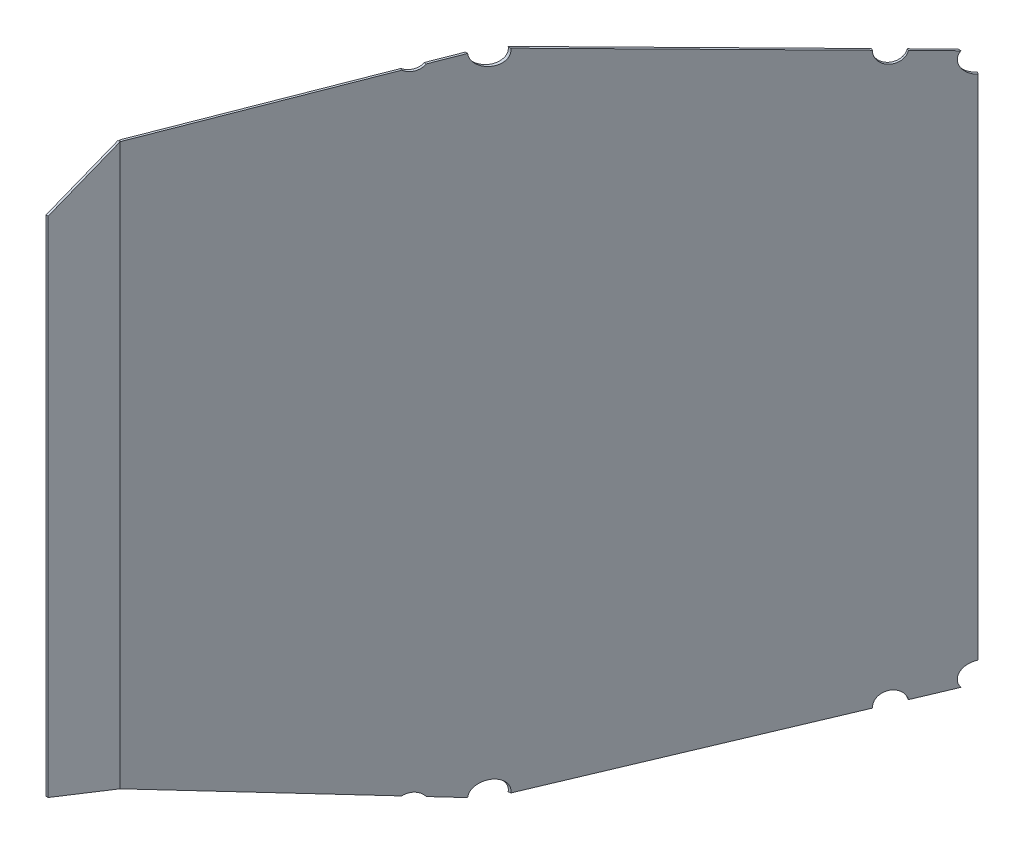
ISO-10303-21;
HEADER;
FILE_DESCRIPTION(('STEP AP214'),'2;1');
FILE_NAME('part.step','',(''),(''),'','','');
FILE_SCHEMA(('AUTOMOTIVE_DESIGN { 1 0 10303 214 1 1 1 1 }'));
ENDSEC;
DATA;
#1=APPLICATION_CONTEXT('core data for automotive mechanical design processes');
#2=APPLICATION_PROTOCOL_DEFINITION('international standard','automotive_design',2000,#1);
#3=PRODUCT_CONTEXT('',#1,'mechanical');
#4=PRODUCT('Part','Part','',(#3));
#5=PRODUCT_RELATED_PRODUCT_CATEGORY('part','',(#4));
#6=PRODUCT_DEFINITION_FORMATION('','',#4);
#7=PRODUCT_DEFINITION_CONTEXT('part definition',#1,'design');
#8=PRODUCT_DEFINITION('design','',#6,#7);
#9=PRODUCT_DEFINITION_SHAPE('','',#8);
#10=(LENGTH_UNIT() NAMED_UNIT(*) SI_UNIT(.MILLI.,.METRE.));
#11=(NAMED_UNIT(*) PLANE_ANGLE_UNIT() SI_UNIT($,.RADIAN.));
#12=(NAMED_UNIT(*) SI_UNIT($,.STERADIAN.) SOLID_ANGLE_UNIT());
#13=UNCERTAINTY_MEASURE_WITH_UNIT(LENGTH_MEASURE(1.E-05),#10,'distance_accuracy_value','');
#14=(GEOMETRIC_REPRESENTATION_CONTEXT(3) GLOBAL_UNCERTAINTY_ASSIGNED_CONTEXT((#13)) GLOBAL_UNIT_ASSIGNED_CONTEXT((#10,
#11,#12)) REPRESENTATION_CONTEXT('',''));
#15=CARTESIAN_POINT('',(0.,0.,0.));
#16=DIRECTION('',(0.,0.,1.));
#17=DIRECTION('',(1.,0.,0.));
#18=AXIS2_PLACEMENT_3D('',#15,#16,#17);
#19=CARTESIAN_POINT('',(10.5410000000001,0.,525.07591607291));
#20=DIRECTION('',(0.,0.,-1.));
#21=DIRECTION('',(-1.,0.,0.));
#22=AXIS2_PLACEMENT_3D('',#19,#20,#21);
#23=PLANE('',#22);
#24=DIRECTION('',(0.,1.,0.));
#25=VECTOR('',#24,1.);
#26=CARTESIAN_POINT('',(12.7000000000001,0.,525.07591607291));
#27=LINE('',#26,#25);
#28=CARTESIAN_POINT('',(12.7000000000001,-279.4,525.07591607291));
#29=VERTEX_POINT('',#28);
#30=CARTESIAN_POINT('',(12.7000000000001,279.4,525.07591607291));
#31=VERTEX_POINT('',#30);
#32=EDGE_CURVE('E122',#29,#31,#27,.T.);
#33=ORIENTED_EDGE('',*,*,#32,.F.);
#34=DIRECTION('',(1.,0.,0.));
#35=VECTOR('',#34,1.);
#36=CARTESIAN_POINT('',(10.5410000000001,-279.4,525.07591607291));
#37=LINE('',#36,#35);
#38=CARTESIAN_POINT('',(10.5410000000001,-279.4,525.07591607291));
#39=VERTEX_POINT('',#38);
#40=EDGE_CURVE('E12',#39,#29,#37,.T.);
#41=ORIENTED_EDGE('',*,*,#40,.F.);
#42=DIRECTION('',(0.,1.,0.));
#43=VECTOR('',#42,1.);
#44=CARTESIAN_POINT('',(10.5410000000001,0.,525.07591607291));
#45=LINE('',#44,#43);
#46=CARTESIAN_POINT('',(10.5410000000001,279.4,525.07591607291));
#47=VERTEX_POINT('',#46);
#48=EDGE_CURVE('E107',#39,#47,#45,.T.);
#49=ORIENTED_EDGE('',*,*,#48,.T.);
#50=DIRECTION('',(1.,0.,0.));
#51=VECTOR('',#50,1.);
#52=CARTESIAN_POINT('',(10.5410000000001,279.4,525.07591607291));
#53=LINE('',#52,#51);
#54=EDGE_CURVE('E75',#47,#31,#53,.T.);
#55=ORIENTED_EDGE('',*,*,#54,.T.);
#56=EDGE_LOOP('',(#33,#41,#49,#55));
#57=FACE_BOUND('',#56,.T.);
#58=ADVANCED_FACE('F59',(#57),#23,.T.);
#59=CARTESIAN_POINT('',(10.5410000000001,-421.142218376144,166.451813741526));
#60=DIRECTION('',(0.,0.929995652978715,-0.367570517643477));
#61=DIRECTION('',(0.,0.367570517643477,0.929995652978715));
#62=AXIS2_PLACEMENT_3D('',#59,#60,#61);
#63=PLANE('',#62);
#64=DIRECTION('',(0.,0.367570517643477,0.929995652978715));
#65=VECTOR('',#64,1.);
#66=CARTESIAN_POINT('',(12.7000000000001,-421.142218376144,166.451813741526));
#67=LINE('',#66,#65);
#68=CARTESIAN_POINT('',(12.7000000000001,-251.012323537438,596.9));
#69=VERTEX_POINT('',#68);
#70=EDGE_CURVE('E113',#29,#69,#67,.T.);
#71=ORIENTED_EDGE('',*,*,#70,.T.);
#72=DIRECTION('',(1.,0.,0.));
#73=VECTOR('',#72,1.);
#74=CARTESIAN_POINT('',(10.5410000000001,-251.012323537438,596.9));
#75=LINE('',#74,#73);
#76=CARTESIAN_POINT('',(10.5410000000001,-251.012323537438,596.9));
#77=VERTEX_POINT('',#76);
#78=EDGE_CURVE('E67',#77,#69,#75,.T.);
#79=ORIENTED_EDGE('',*,*,#78,.F.);
#80=DIRECTION('',(0.,0.367570517643477,0.929995652978715));
#81=VECTOR('',#80,1.);
#82=CARTESIAN_POINT('',(10.5410000000001,-421.142218376144,166.451813741526));
#83=LINE('',#82,#81);
#84=EDGE_CURVE('E101',#39,#77,#83,.T.);
#85=ORIENTED_EDGE('',*,*,#84,.F.);
#86=ORIENTED_EDGE('',*,*,#40,.T.);
#87=EDGE_LOOP('',(#71,#79,#85,#86));
#88=FACE_BOUND('',#87,.T.);
#89=ADVANCED_FACE('F111',(#88),#63,.F.);
#90=CARTESIAN_POINT('',(10.5410000000001,0.,596.9));
#91=DIRECTION('',(0.,0.,1.));
#92=DIRECTION('',(1.,0.,0.));
#93=AXIS2_PLACEMENT_3D('',#90,#91,#92);
#94=PLANE('',#93);
#95=DIRECTION('',(0.,-1.,0.));
#96=VECTOR('',#95,1.);
#97=CARTESIAN_POINT('',(12.7000000000001,0.,596.9));
#98=LINE('',#97,#96);
#99=CARTESIAN_POINT('',(12.7000000000001,251.012323537438,596.9));
#100=VERTEX_POINT('',#99);
#101=EDGE_CURVE('E125',#100,#69,#98,.T.);
#102=ORIENTED_EDGE('',*,*,#101,.F.);
#103=DIRECTION('',(1.,0.,0.));
#104=VECTOR('',#103,1.);
#105=CARTESIAN_POINT('',(10.5410000000001,251.012323537438,596.9));
#106=LINE('',#105,#104);
#107=CARTESIAN_POINT('',(10.5410000000001,251.012323537438,596.9));
#108=VERTEX_POINT('',#107);
#109=EDGE_CURVE('E88',#108,#100,#106,.T.);
#110=ORIENTED_EDGE('',*,*,#109,.F.);
#111=DIRECTION('',(0.,-1.,0.));
#112=VECTOR('',#111,1.);
#113=CARTESIAN_POINT('',(10.5410000000001,0.,596.9));
#114=LINE('',#113,#112);
#115=EDGE_CURVE('E106',#108,#77,#114,.T.);
#116=ORIENTED_EDGE('',*,*,#115,.T.);
#117=ORIENTED_EDGE('',*,*,#78,.T.);
#118=EDGE_LOOP('',(#102,#110,#116,#117));
#119=FACE_BOUND('',#118,.T.);
#120=ADVANCED_FACE('F116',(#119),#94,.T.);
#121=CARTESIAN_POINT('',(10.5410000000001,421.142218376144,166.451813741526));
#122=DIRECTION('',(0.,0.929995652978715,0.367570517643477));
#123=DIRECTION('',(0.,-0.367570517643477,0.929995652978715));
#124=AXIS2_PLACEMENT_3D('',#121,#122,#123);
#125=PLANE('',#124);
#126=DIRECTION('',(0.,-0.367570517643477,0.929995652978715));
#127=VECTOR('',#126,1.);
#128=CARTESIAN_POINT('',(12.7000000000001,421.142218376144,166.451813741526));
#129=LINE('',#128,#127);
#130=EDGE_CURVE('E127',#31,#100,#129,.T.);
#131=ORIENTED_EDGE('',*,*,#130,.F.);
#132=ORIENTED_EDGE('',*,*,#54,.F.);
#133=DIRECTION('',(0.,-0.367570517643477,0.929995652978715));
#134=VECTOR('',#133,1.);
#135=CARTESIAN_POINT('',(10.5410000000001,421.142218376144,166.451813741526));
#136=LINE('',#135,#134);
#137=EDGE_CURVE('E117',#47,#108,#136,.T.);
#138=ORIENTED_EDGE('',*,*,#137,.T.);
#139=ORIENTED_EDGE('',*,*,#109,.T.);
#140=EDGE_LOOP('',(#131,#132,#138,#139));
#141=FACE_BOUND('',#140,.T.);
#142=ADVANCED_FACE('F132',(#141),#125,.T.);
#143=CARTESIAN_POINT('',(10.5410000000001,0.,0.));
#144=DIRECTION('',(-1.,0.,0.));
#145=DIRECTION('',(0.,0.,1.));
#146=AXIS2_PLACEMENT_3D('',#143,#144,#145);
#147=PLANE('',#146);
#148=ORIENTED_EDGE('',*,*,#48,.F.);
#149=ORIENTED_EDGE('',*,*,#84,.T.);
#150=ORIENTED_EDGE('',*,*,#115,.F.);
#151=ORIENTED_EDGE('',*,*,#137,.F.);
#152=EDGE_LOOP('',(#148,#149,#150,#151));
#153=FACE_BOUND('',#152,.T.);
#154=ADVANCED_FACE('F103',(#153),#147,.T.);
#155=CARTESIAN_POINT('',(12.7000000000001,0.,0.));
#156=DIRECTION('',(-1.,0.,0.));
#157=DIRECTION('',(0.,0.,1.));
#158=AXIS2_PLACEMENT_3D('',#155,#156,#157);
#159=PLANE('',#158);
#160=ORIENTED_EDGE('',*,*,#32,.T.);
#161=ORIENTED_EDGE('',*,*,#130,.T.);
#162=ORIENTED_EDGE('',*,*,#101,.T.);
#163=ORIENTED_EDGE('',*,*,#70,.F.);
#164=EDGE_LOOP('',(#160,#161,#162,#163));
#165=FACE_BOUND('',#164,.T.);
#166=ADVANCED_FACE('F139',(#165),#159,.F.);
#167=CLOSED_SHELL('',(#58,#89,#120,#142,#154,#166));
#168=MANIFOLD_SOLID_BREP('B2',#167);
#169=CARTESIAN_POINT('',(217.78075440518,-341.812437501323,214.772548142192));
#170=DIRECTION('',(-0.0920442080609493,-0.986211904406888,0.137527973040296));
#171=DIRECTION('',(0.,-0.138114278991666,-0.990416299309847));
#172=AXIS2_PLACEMENT_3D('',#169,#170,#171);
#173=PLANE('',#172);
#174=CARTESIAN_POINT('',(180.084004303636,-316.675903331611,369.796877031891));
#175=DIRECTION('',(-0.0920442080609493,-0.986211904406888,0.137527973040296));
#176=DIRECTION('',(0.929484119287357,-0.0355511155803089,0.36714491712892));
#177=AXIS2_PLACEMENT_3D('',#174,#175,#176);
#178=ELLIPSE('',#177,73.4026636446802,12.954);
#179=CARTESIAN_POINT('',(125.171787956182,-313.331789130021,357.026047996591));
#180=VERTEX_POINT('',#179);
#181=CARTESIAN_POINT('',(123.373881738882,-313.330680840839,355.830699571687));
#182=VERTEX_POINT('',#181);
#183=EDGE_CURVE('E314',#180,#182,#178,.T.);
#184=ORIENTED_EDGE('',*,*,#183,.F.);
#185=DIRECTION('',(0.548531753129779,-0.165487400143152,-0.819589431485199));
#186=VECTOR('',#185,1.);
#187=CARTESIAN_POINT('',(219.574987038825,-341.812437501323,215.973385456886));
#188=LINE('',#187,#186);
#189=CARTESIAN_POINT('',(12.7000000000003,-279.4,525.07591607291));
#190=VERTEX_POINT('',#189);
#191=EDGE_CURVE('E322',#190,#180,#188,.T.);
#192=ORIENTED_EDGE('',*,*,#191,.F.);
#193=DIRECTION('',(0.831048000762172,0.,0.55620070157201));
#194=VECTOR('',#193,1.);
#195=CARTESIAN_POINT('',(10.9057673663548,-279.4,523.875078758216));
#196=LINE('',#195,#194);
#197=CARTESIAN_POINT('',(10.9057673663548,-279.4,523.875078758216));
#198=VERTEX_POINT('',#197);
#199=EDGE_CURVE('E357',#198,#190,#196,.T.);
#200=ORIENTED_EDGE('',*,*,#199,.F.);
#201=DIRECTION('',(0.548531753129779,-0.165487400143152,-0.819589431485199));
#202=VECTOR('',#201,1.);
#203=CARTESIAN_POINT('',(217.78075440518,-341.812437501323,214.772548142192));
#204=LINE('',#203,#202);
#205=EDGE_CURVE('E324',#198,#182,#204,.T.);
#206=ORIENTED_EDGE('',*,*,#205,.T.);
#207=EDGE_LOOP('',(#184,#192,#200,#206));
#208=FACE_BOUND('',#207,.T.);
#209=ADVANCED_FACE('F189',(#208),#173,.T.);
#210=CARTESIAN_POINT('',(273.305054320382,-293.960977005014,131.810843297464));
#211=DIRECTION('',(-0.0795337615759115,0.989723451821371,0.118835473173525));
#212=DIRECTION('',(0.,-0.1192131197344,0.992868688237871));
#213=AXIS2_PLACEMENT_3D('',#210,#211,#212);
#214=PLANE('',#213);
#215=DIRECTION('',(-0.550484878265318,-0.142994716387668,0.822507695943587));
#216=VECTOR('',#215,1.);
#217=CARTESIAN_POINT('',(275.099286954028,-293.960977005014,133.011680612158));
#218=LINE('',#217,#216);
#219=CARTESIAN_POINT('',(348.785125813966,-274.820241181775,22.9138887611936));
#220=VERTEX_POINT('',#219);
#221=CARTESIAN_POINT('',(327.80523946776,-280.270005591971,54.2610131983872));
#222=VERTEX_POINT('',#221);
#223=EDGE_CURVE('E339',#220,#222,#218,.T.);
#224=ORIENTED_EDGE('',*,*,#223,.T.);
#225=CARTESIAN_POINT('',(333.441864812654,-281.820955652056,70.9505892178949));
#226=DIRECTION('',(-0.0795337615759115,0.989723451821371,0.118835473173525));
#227=DIRECTION('',(0.90767615796685,0.0226240813282437,0.419061025630624));
#228=AXIS2_PLACEMENT_3D('',#225,#226,#227);
#229=ELLIPSE('',#228,165.338648410125,12.954);
#230=CARTESIAN_POINT('',(325.81292932087,-280.321458481864,53.3561336574114));
#231=VERTEX_POINT('',#230);
#232=EDGE_CURVE('E477',#222,#231,#229,.T.);
#233=ORIENTED_EDGE('',*,*,#232,.T.);
#234=DIRECTION('',(-0.550484878265318,-0.142994716387668,0.822507695943587));
#235=VECTOR('',#234,1.);
#236=CARTESIAN_POINT('',(273.305054320382,-293.960977005014,131.810843297464));
#237=LINE('',#236,#235);
#238=CARTESIAN_POINT('',(346.192891207091,-275.027531282455,22.9053871314096));
#239=VERTEX_POINT('',#238);
#240=EDGE_CURVE('E421',#239,#231,#237,.T.);
#241=ORIENTED_EDGE('',*,*,#240,.F.);
#242=CARTESIAN_POINT('',(296.864587760411,-277.246265668834,8.36989513072368));
#243=DIRECTION('',(-0.0795337615759115,0.989723451821371,0.118835473173525));
#244=DIRECTION('',(0.995554786287447,0.072832158220692,0.0597172021202568));
#245=AXIS2_PLACEMENT_3D('',#242,#243,#244);
#246=ELLIPSE('',#245,114.450133275038,12.954);
#247=EDGE_CURVE('E470',#239,#220,#246,.T.);
#248=ORIENTED_EDGE('',*,*,#247,.T.);
#249=EDGE_LOOP('',(#224,#233,#241,#248));
#250=FACE_BOUND('',#249,.T.);
#251=ADVANCED_FACE('F538',(#250),#214,.F.);
#252=CARTESIAN_POINT('',(217.78075440518,341.812437501323,214.772548142192));
#253=DIRECTION('',(0.0920442080609493,-0.986211904406888,-0.137527973040296));
#254=DIRECTION('',(0.,0.138114278991666,-0.990416299309847));
#255=AXIS2_PLACEMENT_3D('',#252,#253,#254);
#256=PLANE('',#255);
#257=CARTESIAN_POINT('',(180.084004303636,316.675903331611,369.796877031891));
#258=DIRECTION('',(0.0920442080609493,-0.986211904406888,-0.137527973040296));
#259=DIRECTION('',(0.929484119287357,0.0355511155803089,0.36714491712892));
#260=AXIS2_PLACEMENT_3D('',#257,#258,#259);
#261=ELLIPSE('',#260,73.4026636446802,12.954);
#262=CARTESIAN_POINT('',(135.029482840484,316.305772474649,342.297160380001));
#263=VERTEX_POINT('',#262);
#264=CARTESIAN_POINT('',(132.734915399894,316.154825686373,341.843898967041));
#265=VERTEX_POINT('',#264);
#266=EDGE_CURVE('E460',#263,#265,#261,.F.);
#267=ORIENTED_EDGE('',*,*,#266,.F.);
#268=DIRECTION('',(0.548531753129779,0.165487400143152,-0.819589431485199));
#269=VECTOR('',#268,1.);
#270=CARTESIAN_POINT('',(219.574987038825,341.812437501323,215.973385456886));
#271=LINE('',#270,#269);
#272=CARTESIAN_POINT('',(151.584505427097,321.300283059566,317.561451877132));
#273=VERTEX_POINT('',#272);
#274=EDGE_CURVE('E337',#263,#273,#271,.T.);
#275=ORIENTED_EDGE('',*,*,#274,.T.);
#276=CARTESIAN_POINT('',(147.589152739267,322.730018641027,304.634835674143));
#277=DIRECTION('',(0.0920442080609493,-0.986211904406888,-0.137527973040296));
#278=DIRECTION('',(0.995554113494674,0.0883700859270627,0.0325996168241001));
#279=AXIS2_PLACEMENT_3D('',#276,#277,#278);
#280=ELLIPSE('',#279,56.5707851875169,12.954);
#281=CARTESIAN_POINT('',(149.022082967497,321.068526672833,317.508406388771));
#282=VERTEX_POINT('',#281);
#283=EDGE_CURVE('E452',#282,#273,#280,.F.);
#284=ORIENTED_EDGE('',*,*,#283,.F.);
#285=DIRECTION('',(0.548531753129779,0.165487400143152,-0.819589431485199));
#286=VECTOR('',#285,1.);
#287=CARTESIAN_POINT('',(217.78075440518,341.812437501323,214.772548142192));
#288=LINE('',#287,#286);
#289=EDGE_CURVE('E414',#265,#282,#288,.T.);
#290=ORIENTED_EDGE('',*,*,#289,.F.);
#291=EDGE_LOOP('',(#267,#275,#284,#290));
#292=FACE_BOUND('',#291,.T.);
#293=ADVANCED_FACE('F517',(#292),#256,.F.);
#294=CARTESIAN_POINT('',(273.305054320382,293.960977005014,131.810843297464));
#295=DIRECTION('',(0.0795337615759115,0.989723451821371,-0.118835473173525));
#296=DIRECTION('',(0.,0.1192131197344,0.992868688237871));
#297=AXIS2_PLACEMENT_3D('',#294,#295,#296);
#298=PLANE('',#297);
#299=DIRECTION('',(-0.550484878265318,0.142994716387668,0.822507695943587));
#300=VECTOR('',#299,1.);
#301=CARTESIAN_POINT('',(273.305054320382,293.960977005014,131.810843297464));
#302=LINE('',#301,#300);
#303=CARTESIAN_POINT('',(311.440797781742,284.05478332777,74.8302726660928));
#304=VERTEX_POINT('',#303);
#305=CARTESIAN_POINT('',(166.233377232908,321.774064526186,291.792128704522));
#306=VERTEX_POINT('',#305);
#307=EDGE_CURVE('E409',#304,#306,#302,.T.);
#308=ORIENTED_EDGE('',*,*,#307,.T.);
#309=CARTESIAN_POINT('',(113.344182062824,327.565232050473,304.626492324102));
#310=DIRECTION('',(0.0795337615759115,0.989723451821371,-0.118835473173525));
#311=DIRECTION('',(0.996697180519597,-0.0809177469176293,-0.00685919660457928));
#312=AXIS2_PLACEMENT_3D('',#309,#310,#311);
#313=ELLIPSE('',#312,217.176234772577,12.954);
#314=CARTESIAN_POINT('',(168.816536568898,321.569131830473,291.814190162088));
#315=VERTEX_POINT('',#314);
#316=EDGE_CURVE('E448',#306,#315,#313,.F.);
#317=ORIENTED_EDGE('',*,*,#316,.T.);
#318=DIRECTION('',(-0.550484878265318,0.142994716387668,0.822507695943587));
#319=VECTOR('',#318,1.);
#320=CARTESIAN_POINT('',(275.099286954028,293.960977005014,133.011680612158));
#321=LINE('',#320,#319);
#322=CARTESIAN_POINT('',(313.415431512691,284.007922088228,75.7615634469087));
#323=VERTEX_POINT('',#322);
#324=EDGE_CURVE('E347',#323,#315,#321,.T.);
#325=ORIENTED_EDGE('',*,*,#324,.F.);
#326=CARTESIAN_POINT('',(333.441864812654,281.820955652056,70.9505892178949));
#327=DIRECTION('',(0.0795337615759115,0.989723451821371,-0.118835473173525));
#328=DIRECTION('',(0.90767615796685,-0.0226240813282437,0.419061025630624));
#329=AXIS2_PLACEMENT_3D('',#326,#327,#328);
#330=ELLIPSE('',#329,165.338648410125,12.954);
#331=EDGE_CURVE('E439',#323,#304,#330,.F.);
#332=ORIENTED_EDGE('',*,*,#331,.T.);
#333=EDGE_LOOP('',(#308,#317,#325,#332));
#334=FACE_BOUND('',#333,.T.);
#335=ADVANCED_FACE('F499',(#334),#298,.T.);
#336=CARTESIAN_POINT('',(353.805767366355,0.,11.5305983288704));
#337=DIRECTION('',(0.55620070157201,0.,-0.831048000762172));
#338=DIRECTION('',(-0.831048000762172,0.,-0.55620070157201));
#339=AXIS2_PLACEMENT_3D('',#336,#337,#338);
#340=PLANE('',#339);
#341=CARTESIAN_POINT('',(355.6,-266.19702970297,12.7314356435645));
#342=DIRECTION('',(0.55620070157201,0.,-0.831048000762172));
#343=DIRECTION('',(0.812373648709568,0.210800270497735,0.543702400988247));
#344=AXIS2_PLACEMENT_3D('',#341,#342,#343);
#345=ELLIPSE('',#344,26.7271202105621,12.954);
#346=CARTESIAN_POINT('',(353.805767366355,-253.413996600512,11.5305983288704));
#347=VERTEX_POINT('',#346);
#348=CARTESIAN_POINT('',(355.6,-253.0170453242,12.7314356435644));
#349=VERTEX_POINT('',#348);
#350=EDGE_CURVE('E467',#347,#349,#345,.T.);
#351=ORIENTED_EDGE('',*,*,#350,.F.);
#352=DIRECTION('',(0.,1.,0.));
#353=VECTOR('',#352,1.);
#354=CARTESIAN_POINT('',(353.805767366355,0.,11.5305983288704));
#355=LINE('',#354,#353);
#356=CARTESIAN_POINT('',(353.805767366355,253.413996600512,11.5305983288704));
#357=VERTEX_POINT('',#356);
#358=EDGE_CURVE('E352',#347,#357,#355,.T.);
#359=ORIENTED_EDGE('',*,*,#358,.T.);
#360=CARTESIAN_POINT('',(355.6,266.19702970297,12.7314356435645));
#361=DIRECTION('',(0.55620070157201,0.,-0.831048000762172));
#362=DIRECTION('',(0.812373648709568,-0.210800270497735,0.543702400988247));
#363=AXIS2_PLACEMENT_3D('',#360,#361,#362);
#364=ELLIPSE('',#363,26.7271202105621,12.954);
#365=CARTESIAN_POINT('',(355.6,253.0170453242,12.7314356435644));
#366=VERTEX_POINT('',#365);
#367=EDGE_CURVE('E403',#357,#366,#364,.F.);
#368=ORIENTED_EDGE('',*,*,#367,.T.);
#369=DIRECTION('',(0.,1.,0.));
#370=VECTOR('',#369,1.);
#371=CARTESIAN_POINT('',(355.6,0.,12.7314356435644));
#372=LINE('',#371,#370);
#373=EDGE_CURVE('E394',#349,#366,#372,.T.);
#374=ORIENTED_EDGE('',*,*,#373,.F.);
#375=EDGE_LOOP('',(#351,#359,#368,#374));
#376=FACE_BOUND('',#375,.T.);
#377=ADVANCED_FACE('F191',(#376),#340,.T.);
#378=CARTESIAN_POINT('',(313.415431512691,-284.007922088228,75.7615634469087));
#379=VERTEX_POINT('',#378);
#380=CARTESIAN_POINT('',(168.816536568898,-321.569131830473,291.814190162088));
#381=VERTEX_POINT('',#380);
#382=EDGE_CURVE('E384',#379,#381,#218,.T.);
#383=ORIENTED_EDGE('',*,*,#382,.T.);
#384=CARTESIAN_POINT('',(113.344182062824,-327.565232050473,304.626492324102));
#385=DIRECTION('',(-0.0795337615759115,0.989723451821371,0.118835473173525));
#386=DIRECTION('',(0.996697180519597,0.0809177469176293,-0.00685919660457928));
#387=AXIS2_PLACEMENT_3D('',#384,#385,#386);
#388=ELLIPSE('',#387,217.176234772577,12.954);
#389=CARTESIAN_POINT('',(166.233377232908,-321.774064526186,291.792128704522));
#390=VERTEX_POINT('',#389);
#391=EDGE_CURVE('E212',#381,#390,#388,.T.);
#392=ORIENTED_EDGE('',*,*,#391,.T.);
#393=CARTESIAN_POINT('',(311.440797781742,-284.05478332777,74.8302726660928));
#394=VERTEX_POINT('',#393);
#395=EDGE_CURVE('E425',#394,#390,#237,.T.);
#396=ORIENTED_EDGE('',*,*,#395,.F.);
#397=EDGE_CURVE('E392',#394,#379,#229,.T.);
#398=ORIENTED_EDGE('',*,*,#397,.T.);
#399=EDGE_LOOP('',(#383,#392,#396,#398));
#400=FACE_BOUND('',#399,.T.);
#401=ADVANCED_FACE('F389',(#400),#214,.F.);
#402=CARTESIAN_POINT('',(132.734915399894,-316.154825686373,341.843898967041));
#403=VERTEX_POINT('',#402);
#404=CARTESIAN_POINT('',(135.029482840484,-316.305772474649,342.297160380001));
#405=VERTEX_POINT('',#404);
#406=EDGE_CURVE('E205',#403,#405,#178,.T.);
#407=ORIENTED_EDGE('',*,*,#406,.F.);
#408=CARTESIAN_POINT('',(149.022082967497,-321.068526672833,317.508406388771));
#409=VERTEX_POINT('',#408);
#410=EDGE_CURVE('E420',#403,#409,#204,.T.);
#411=ORIENTED_EDGE('',*,*,#410,.T.);
#412=CARTESIAN_POINT('',(147.589152739267,-322.730018641027,304.634835674143));
#413=DIRECTION('',(-0.0920442080609493,-0.986211904406888,0.137527973040296));
#414=DIRECTION('',(0.995554113494674,-0.0883700859270627,0.0325996168241001));
#415=AXIS2_PLACEMENT_3D('',#412,#413,#414);
#416=ELLIPSE('',#415,56.5707851875169,12.954);
#417=CARTESIAN_POINT('',(151.584505427097,-321.300283059566,317.561451877132));
#418=VERTEX_POINT('',#417);
#419=EDGE_CURVE('E485',#418,#409,#416,.T.);
#420=ORIENTED_EDGE('',*,*,#419,.F.);
#421=EDGE_CURVE('E333',#405,#418,#188,.T.);
#422=ORIENTED_EDGE('',*,*,#421,.F.);
#423=EDGE_LOOP('',(#407,#411,#420,#422));
#424=FACE_BOUND('',#423,.T.);
#425=ADVANCED_FACE('F556',(#424),#173,.T.);
#426=CARTESIAN_POINT('',(10.9057673663548,0.,523.875078758216));
#427=DIRECTION('',(0.55620070157201,0.,-0.831048000762172));
#428=DIRECTION('',(-0.831048000762172,0.,-0.55620070157201));
#429=AXIS2_PLACEMENT_3D('',#426,#427,#428);
#430=PLANE('',#429);
#431=DIRECTION('',(0.,1.,0.));
#432=VECTOR('',#431,1.);
#433=CARTESIAN_POINT('',(12.7000000000003,0.,525.07591607291));
#434=LINE('',#433,#432);
#435=CARTESIAN_POINT('',(12.7000000000003,279.4,525.07591607291));
#436=VERTEX_POINT('',#435);
#437=EDGE_CURVE('E331',#190,#436,#434,.T.);
#438=ORIENTED_EDGE('',*,*,#437,.T.);
#439=DIRECTION('',(0.831048000762172,0.,0.55620070157201));
#440=VECTOR('',#439,1.);
#441=CARTESIAN_POINT('',(10.9057673663548,279.4,523.875078758216));
#442=LINE('',#441,#440);
#443=CARTESIAN_POINT('',(10.9057673663548,279.4,523.875078758216));
#444=VERTEX_POINT('',#443);
#445=EDGE_CURVE('E353',#444,#436,#442,.T.);
#446=ORIENTED_EDGE('',*,*,#445,.F.);
#447=DIRECTION('',(0.,1.,0.));
#448=VECTOR('',#447,1.);
#449=CARTESIAN_POINT('',(10.9057673663548,0.,523.875078758216));
#450=LINE('',#449,#448);
#451=EDGE_CURVE('E415',#198,#444,#450,.T.);
#452=ORIENTED_EDGE('',*,*,#451,.F.);
#453=ORIENTED_EDGE('',*,*,#199,.T.);
#454=EDGE_LOOP('',(#438,#446,#452,#453));
#455=FACE_BOUND('',#454,.T.);
#456=ADVANCED_FACE('F563',(#455),#430,.F.);
#457=CARTESIAN_POINT('',(123.373881738882,313.330680840839,355.830699571687));
#458=VERTEX_POINT('',#457);
#459=CARTESIAN_POINT('',(125.171787956182,313.331789130021,357.026047996591));
#460=VERTEX_POINT('',#459);
#461=EDGE_CURVE('E461',#458,#460,#261,.F.);
#462=ORIENTED_EDGE('',*,*,#461,.F.);
#463=EDGE_CURVE('E410',#444,#458,#288,.T.);
#464=ORIENTED_EDGE('',*,*,#463,.F.);
#465=ORIENTED_EDGE('',*,*,#445,.T.);
#466=EDGE_CURVE('E343',#436,#460,#271,.T.);
#467=ORIENTED_EDGE('',*,*,#466,.T.);
#468=EDGE_LOOP('',(#462,#464,#465,#467));
#469=FACE_BOUND('',#468,.T.);
#470=ADVANCED_FACE('F570',(#469),#256,.F.);
#471=CARTESIAN_POINT('',(346.192891207091,275.027531282455,22.9053871314096));
#472=VERTEX_POINT('',#471);
#473=CARTESIAN_POINT('',(325.81292932087,280.321458481864,53.3561336574114));
#474=VERTEX_POINT('',#473);
#475=EDGE_CURVE('E358',#472,#474,#302,.T.);
#476=ORIENTED_EDGE('',*,*,#475,.T.);
#477=CARTESIAN_POINT('',(327.80523946776,280.270005591971,54.2610131983872));
#478=VERTEX_POINT('',#477);
#479=EDGE_CURVE('E440',#474,#478,#330,.F.);
#480=ORIENTED_EDGE('',*,*,#479,.T.);
#481=CARTESIAN_POINT('',(348.785125813966,274.820241181775,22.9138887611936));
#482=VERTEX_POINT('',#481);
#483=EDGE_CURVE('E348',#482,#478,#321,.T.);
#484=ORIENTED_EDGE('',*,*,#483,.F.);
#485=CARTESIAN_POINT('',(296.864587760411,277.246265668834,8.36989513072368));
#486=DIRECTION('',(0.0795337615759115,0.989723451821371,-0.118835473173525));
#487=DIRECTION('',(0.995554786287447,-0.072832158220692,0.0597172021202568));
#488=AXIS2_PLACEMENT_3D('',#485,#486,#487);
#489=ELLIPSE('',#488,114.450133275038,12.954);
#490=EDGE_CURVE('E431',#482,#472,#489,.F.);
#491=ORIENTED_EDGE('',*,*,#490,.T.);
#492=EDGE_LOOP('',(#476,#480,#484,#491));
#493=FACE_BOUND('',#492,.T.);
#494=ADVANCED_FACE('F526',(#493),#298,.T.);
#495=CARTESIAN_POINT('',(249.682473472456,0.,167.10655315728));
#496=DIRECTION('',(-0.831048000762173,0.,-0.55620070157201));
#497=DIRECTION('',(-0.55620070157201,0.,0.831048000762173));
#498=AXIS2_PLACEMENT_3D('',#495,#496,#497);
#499=PLANE('',#498);
#500=CARTESIAN_POINT('',(126.910839100546,-324.616547019948,350.545950135226));
#501=DIRECTION('',(-0.831048000762173,0.,-0.55620070157201));
#502=DIRECTION('',(0.480110672976889,0.50486756882654,-0.717357985695327));
#503=AXIS2_PLACEMENT_3D('',#500,#501,#502);
#504=ELLIPSE('',#503,13.4751779576768,12.954);
#505=EDGE_CURVE('E326',#182,#403,#504,.T.);
#506=ORIENTED_EDGE('',*,*,#505,.F.);
#507=ORIENTED_EDGE('',*,*,#205,.F.);
#508=ORIENTED_EDGE('',*,*,#451,.T.);
#509=ORIENTED_EDGE('',*,*,#463,.T.);
#510=CARTESIAN_POINT('',(126.910839100546,324.616547019948,350.545950135226));
#511=DIRECTION('',(-0.831048000762173,0.,-0.55620070157201));
#512=DIRECTION('',(0.480110672976889,-0.50486756882654,-0.717357985695327));
#513=AXIS2_PLACEMENT_3D('',#510,#511,#512);
#514=ELLIPSE('',#513,13.4751779576768,12.954);
#515=EDGE_CURVE('E456',#458,#265,#514,.F.);
#516=ORIENTED_EDGE('',*,*,#515,.T.);
#517=ORIENTED_EDGE('',*,*,#289,.T.);
#518=CARTESIAN_POINT('',(157.636419972562,321.311396277069,304.637283562573));
#519=DIRECTION('',(-0.831048000762173,0.,-0.55620070157201));
#520=DIRECTION('',(0.539089390238009,-0.246135747929268,-0.805481112704768));
#521=AXIS2_PLACEMENT_3D('',#518,#519,#520);
#522=ELLIPSE('',#521,15.7395910080123,12.954);
#523=EDGE_CURVE('E444',#282,#306,#522,.F.);
#524=ORIENTED_EDGE('',*,*,#523,.T.);
#525=ORIENTED_EDGE('',*,*,#307,.F.);
#526=CARTESIAN_POINT('',(318.719991779222,283.460768242413,63.9540554990364));
#527=DIRECTION('',(-0.831048000762173,0.,-0.55620070157201));
#528=DIRECTION('',(0.45763108226935,-0.568359283952727,-0.683770076038523));
#529=AXIS2_PLACEMENT_3D('',#526,#527,#528);
#530=ELLIPSE('',#529,13.1596957943614,12.954);
#531=EDGE_CURVE('E435',#304,#474,#530,.F.);
#532=ORIENTED_EDGE('',*,*,#531,.T.);
#533=ORIENTED_EDGE('',*,*,#475,.F.);
#534=CARTESIAN_POINT('',(353.125076038074,266.662609458184,12.5476541612432));
#535=DIRECTION('',(-0.831048000762173,0.,-0.55620070157201));
#536=DIRECTION('',(0.51985292328741,-0.355569384705911,-0.776738920622235));
#537=AXIS2_PLACEMENT_3D('',#534,#535,#536);
#538=ELLIPSE('',#537,15.1501945639283,12.954);
#539=EDGE_CURVE('E398',#472,#357,#538,.F.);
#540=ORIENTED_EDGE('',*,*,#539,.T.);
#541=ORIENTED_EDGE('',*,*,#358,.F.);
#542=CARTESIAN_POINT('',(353.125076038074,-266.662609458184,12.5476541612432));
#543=DIRECTION('',(-0.831048000762173,0.,-0.55620070157201));
#544=DIRECTION('',(0.51985292328741,0.355569384705911,-0.776738920622235));
#545=AXIS2_PLACEMENT_3D('',#542,#543,#544);
#546=ELLIPSE('',#545,15.1501945639283,12.954);
#547=EDGE_CURVE('E464',#239,#347,#546,.T.);
#548=ORIENTED_EDGE('',*,*,#547,.F.);
#549=ORIENTED_EDGE('',*,*,#240,.T.);
#550=CARTESIAN_POINT('',(318.719991779222,-283.460768242413,63.9540554990364));
#551=DIRECTION('',(-0.831048000762173,0.,-0.55620070157201));
#552=DIRECTION('',(0.45763108226935,0.568359283952727,-0.683770076038523));
#553=AXIS2_PLACEMENT_3D('',#550,#551,#552);
#554=ELLIPSE('',#553,13.1596957943614,12.954);
#555=EDGE_CURVE('E474',#394,#231,#554,.T.);
#556=ORIENTED_EDGE('',*,*,#555,.F.);
#557=ORIENTED_EDGE('',*,*,#395,.T.);
#558=CARTESIAN_POINT('',(157.636419972562,-321.311396277069,304.637283562573));
#559=DIRECTION('',(-0.831048000762173,0.,-0.55620070157201));
#560=DIRECTION('',(0.539089390238009,0.246135747929268,-0.805481112704769));
#561=AXIS2_PLACEMENT_3D('',#558,#559,#560);
#562=ELLIPSE('',#561,15.7395910080123,12.954);
#563=EDGE_CURVE('E480',#409,#390,#562,.T.);
#564=ORIENTED_EDGE('',*,*,#563,.F.);
#565=ORIENTED_EDGE('',*,*,#410,.F.);
#566=EDGE_LOOP('',(#506,#507,#508,#509,#516,#517,#524,#525,#532,#533,#540,#541,#548,#549,#556,
#557,#564,#565));
#567=FACE_BOUND('',#566,.T.);
#568=ADVANCED_FACE('F504',(#567),#499,.T.);
#569=CARTESIAN_POINT('',(251.476706106102,0.,168.307390471974));
#570=DIRECTION('',(-0.831048000762173,0.,-0.55620070157201));
#571=DIRECTION('',(-0.55620070157201,0.,0.831048000762173));
#572=AXIS2_PLACEMENT_3D('',#569,#570,#571);
#573=PLANE('',#572);
#574=ORIENTED_EDGE('',*,*,#191,.T.);
#575=CARTESIAN_POINT('',(129.002050198817,-324.304254867599,351.303056691222));
#576=DIRECTION('',(-0.831048000762173,0.,-0.55620070157201));
#577=DIRECTION('',(0.480110672976889,0.50486756882654,-0.717357985695327));
#578=AXIS2_PLACEMENT_3D('',#575,#576,#577);
#579=ELLIPSE('',#578,13.4751779576768,12.954);
#580=EDGE_CURVE('E57',#180,#405,#579,.T.);
#581=ORIENTED_EDGE('',*,*,#580,.T.);
#582=ORIENTED_EDGE('',*,*,#421,.T.);
#583=CARTESIAN_POINT('',(160.233920968338,-320.944642520306,304.637916410539));
#584=DIRECTION('',(-0.831048000762173,0.,-0.55620070157201));
#585=DIRECTION('',(0.539089390238009,0.246135747929268,-0.805481112704769));
#586=AXIS2_PLACEMENT_3D('',#583,#584,#585);
#587=ELLIPSE('',#586,15.7395910080123,12.954);
#588=EDGE_CURVE('E198',#418,#381,#587,.T.);
#589=ORIENTED_EDGE('',*,*,#588,.T.);
#590=ORIENTED_EDGE('',*,*,#382,.F.);
#591=CARTESIAN_POINT('',(320.690995462248,-283.241225752967,64.8907701206723));
#592=DIRECTION('',(-0.831048000762173,0.,-0.55620070157201));
#593=DIRECTION('',(0.45763108226935,0.568359283952727,-0.683770076038523));
#594=AXIS2_PLACEMENT_3D('',#591,#592,#593);
#595=ELLIPSE('',#594,13.1596957943614,12.954);
#596=EDGE_CURVE('E378',#379,#222,#595,.T.);
#597=ORIENTED_EDGE('',*,*,#596,.T.);
#598=ORIENTED_EDGE('',*,*,#223,.F.);
#599=CARTESIAN_POINT('',(355.6,-266.19702970297,12.7314356435645));
#600=DIRECTION('',(-0.831048000762173,0.,-0.55620070157201));
#601=DIRECTION('',(0.51985292328741,0.355569384705911,-0.776738920622235));
#602=AXIS2_PLACEMENT_3D('',#599,#600,#601);
#603=ELLIPSE('',#602,15.1501945639283,12.954);
#604=EDGE_CURVE('E374',#220,#349,#603,.T.);
#605=ORIENTED_EDGE('',*,*,#604,.T.);
#606=ORIENTED_EDGE('',*,*,#373,.T.);
#607=CARTESIAN_POINT('',(355.6,266.19702970297,12.7314356435645));
#608=DIRECTION('',(-0.831048000762173,0.,-0.55620070157201));
#609=DIRECTION('',(0.51985292328741,-0.355569384705911,-0.776738920622235));
#610=AXIS2_PLACEMENT_3D('',#607,#608,#609);
#611=ELLIPSE('',#610,15.1501945639283,12.954);
#612=EDGE_CURVE('E361',#482,#366,#611,.F.);
#613=ORIENTED_EDGE('',*,*,#612,.F.);
#614=ORIENTED_EDGE('',*,*,#483,.T.);
#615=CARTESIAN_POINT('',(320.690995462248,283.241225752967,64.8907701206723));
#616=DIRECTION('',(-0.831048000762173,0.,-0.55620070157201));
#617=DIRECTION('',(0.45763108226935,-0.568359283952727,-0.683770076038523));
#618=AXIS2_PLACEMENT_3D('',#615,#616,#617);
#619=ELLIPSE('',#618,13.1596957943614,12.954);
#620=EDGE_CURVE('E365',#323,#478,#619,.F.);
#621=ORIENTED_EDGE('',*,*,#620,.F.);
#622=ORIENTED_EDGE('',*,*,#324,.T.);
#623=CARTESIAN_POINT('',(160.233920968338,320.944642520306,304.637916410539));
#624=DIRECTION('',(-0.831048000762173,0.,-0.55620070157201));
#625=DIRECTION('',(0.539089390238009,-0.246135747929268,-0.805481112704768));
#626=AXIS2_PLACEMENT_3D('',#623,#624,#625);
#627=ELLIPSE('',#626,15.7395910080123,12.954);
#628=EDGE_CURVE('E368',#273,#315,#627,.F.);
#629=ORIENTED_EDGE('',*,*,#628,.F.);
#630=ORIENTED_EDGE('',*,*,#274,.F.);
#631=CARTESIAN_POINT('',(129.002050198817,324.304254867599,351.303056691222));
#632=DIRECTION('',(-0.831048000762173,0.,-0.55620070157201));
#633=DIRECTION('',(0.480110672976889,-0.50486756882654,-0.717357985695327));
#634=AXIS2_PLACEMENT_3D('',#631,#632,#633);
#635=ELLIPSE('',#634,13.4751779576768,12.954);
#636=EDGE_CURVE('E371',#460,#263,#635,.F.);
#637=ORIENTED_EDGE('',*,*,#636,.F.);
#638=ORIENTED_EDGE('',*,*,#466,.F.);
#639=ORIENTED_EDGE('',*,*,#437,.F.);
#640=EDGE_LOOP('',(#574,#581,#582,#589,#590,#597,#598,#605,#606,#613,#614,#621,#622,#629,#630,
#637,#638,#639));
#641=FACE_BOUND('',#640,.T.);
#642=ADVANCED_FACE('F329',(#641),#573,.F.);
#643=CARTESIAN_POINT('',(216.171744195036,292.426107527666,2.37785229171068));
#644=DIRECTION('',(0.980155318065139,-0.184385653893442,0.0727838107474112));
#645=DIRECTION('',(0.184875992870928,0.982761856840195,0.));
#646=AXIS2_PLACEMENT_3D('',#643,#644,#645);
#647=CYLINDRICAL_SURFACE('',#646,12.954);
#648=ORIENTED_EDGE('',*,*,#490,.F.);
#649=ORIENTED_EDGE('',*,*,#612,.T.);
#650=ORIENTED_EDGE('',*,*,#367,.F.);
#651=ORIENTED_EDGE('',*,*,#539,.F.);
#652=EDGE_LOOP('',(#648,#649,#650,#651));
#653=FACE_BOUND('',#652,.T.);
#654=ADVANCED_FACE('F531',(#653),#647,.F.);
#655=CARTESIAN_POINT('',(46.0874429488324,313.828255117086,-65.6138884995647));
#656=DIRECTION('',(0.898654671274461,-0.100097673780571,0.427083408130437));
#657=DIRECTION('',(0.429239212420543,0.,-0.90319084280156));
#658=AXIS2_PLACEMENT_3D('',#655,#656,#657);
#659=CYLINDRICAL_SURFACE('',#658,12.954);
#660=ORIENTED_EDGE('',*,*,#331,.F.);
#661=ORIENTED_EDGE('',*,*,#620,.T.);
#662=ORIENTED_EDGE('',*,*,#479,.F.);
#663=ORIENTED_EDGE('',*,*,#531,.F.);
#664=EDGE_LOOP('',(#660,#661,#662,#663));
#665=FACE_BOUND('',#664,.T.);
#666=ADVANCED_FACE('F524',(#665),#659,.F.);
#667=CARTESIAN_POINT('',(12.9947335983297,341.734057114756,304.602043461729));
#668=DIRECTION('',(0.990178586389027,-0.139808114420369,0.000241244375066887));
#669=DIRECTION('',(0.139808118488705,0.990178615202655,0.));
#670=AXIS2_PLACEMENT_3D('',#667,#668,#669);
#671=CYLINDRICAL_SURFACE('',#670,12.954);
#672=ORIENTED_EDGE('',*,*,#283,.T.);
#673=ORIENTED_EDGE('',*,*,#628,.T.);
#674=ORIENTED_EDGE('',*,*,#316,.F.);
#675=ORIENTED_EDGE('',*,*,#523,.F.);
#676=EDGE_LOOP('',(#672,#673,#674,#675));
#677=FACE_BOUND('',#676,.T.);
#678=ADVANCED_FACE('F522',(#677),#671,.F.);
#679=CARTESIAN_POINT('',(-80.0323256290763,355.520517633292,275.623802454936));
#680=DIRECTION('',(0.931139212338283,-0.139052183205139,0.337111639656549));
#681=DIRECTION('',(0.340418789440352,0.,-0.940273921682381));
#682=AXIS2_PLACEMENT_3D('',#679,#680,#681);
#683=CYLINDRICAL_SURFACE('',#682,12.954);
#684=ORIENTED_EDGE('',*,*,#461,.T.);
#685=ORIENTED_EDGE('',*,*,#636,.T.);
#686=ORIENTED_EDGE('',*,*,#266,.T.);
#687=ORIENTED_EDGE('',*,*,#515,.F.);
#688=EDGE_LOOP('',(#684,#685,#686,#687));
#689=FACE_BOUND('',#688,.T.);
#690=ADVANCED_FACE('F552',(#689),#683,.F.);
#691=CARTESIAN_POINT('',(216.171744195036,-292.426107527666,2.37785229171068));
#692=DIRECTION('',(0.980155318065139,0.184385653893442,0.0727838107474112));
#693=DIRECTION('',(-0.184875992870928,0.982761856840195,0.));
#694=AXIS2_PLACEMENT_3D('',#691,#692,#693);
#695=CYLINDRICAL_SURFACE('',#694,12.954);
#696=ORIENTED_EDGE('',*,*,#547,.T.);
#697=ORIENTED_EDGE('',*,*,#350,.T.);
#698=ORIENTED_EDGE('',*,*,#604,.F.);
#699=ORIENTED_EDGE('',*,*,#247,.F.);
#700=EDGE_LOOP('',(#696,#697,#698,#699));
#701=FACE_BOUND('',#700,.T.);
#702=ADVANCED_FACE('F535',(#701),#695,.F.);
#703=CARTESIAN_POINT('',(46.3820218581467,-313.79544310986,-65.4738906020689));
#704=DIRECTION('',(0.898654671274461,0.100097673780571,0.427083408130437));
#705=DIRECTION('',(0.429239212420543,0.,-0.90319084280156));
#706=AXIS2_PLACEMENT_3D('',#703,#704,#705);
#707=CYLINDRICAL_SURFACE('',#706,12.954);
#708=ORIENTED_EDGE('',*,*,#555,.T.);
#709=ORIENTED_EDGE('',*,*,#232,.F.);
#710=ORIENTED_EDGE('',*,*,#596,.F.);
#711=ORIENTED_EDGE('',*,*,#397,.F.);
#712=EDGE_LOOP('',(#708,#709,#710,#711));
#713=FACE_BOUND('',#712,.T.);
#714=ADVANCED_FACE('F543',(#713),#707,.F.);
#715=CARTESIAN_POINT('',(13.3523710878513,-341.683560543993,304.602130595539));
#716=DIRECTION('',(0.990178586389027,0.139808114420369,0.000241244375066887));
#717=DIRECTION('',(-0.139808118488705,0.990178615202655,0.));
#718=AXIS2_PLACEMENT_3D('',#715,#716,#717);
#719=CYLINDRICAL_SURFACE('',#718,12.954);
#720=ORIENTED_EDGE('',*,*,#563,.T.);
#721=ORIENTED_EDGE('',*,*,#391,.F.);
#722=ORIENTED_EDGE('',*,*,#588,.F.);
#723=ORIENTED_EDGE('',*,*,#419,.T.);
#724=EDGE_LOOP('',(#720,#721,#722,#723));
#725=FACE_BOUND('',#724,.T.);
#726=ADVANCED_FACE('F545',(#725),#719,.F.);
#727=CARTESIAN_POINT('',(-79.7160649421984,-355.47328867076,275.738302153047));
#728=DIRECTION('',(0.931139212338283,0.139052183205139,0.337111639656549));
#729=DIRECTION('',(0.340418789440352,0.,-0.940273921682381));
#730=AXIS2_PLACEMENT_3D('',#727,#728,#729);
#731=CYLINDRICAL_SURFACE('',#730,12.954);
#732=ORIENTED_EDGE('',*,*,#505,.T.);
#733=ORIENTED_EDGE('',*,*,#406,.T.);
#734=ORIENTED_EDGE('',*,*,#580,.F.);
#735=ORIENTED_EDGE('',*,*,#183,.T.);
#736=EDGE_LOOP('',(#732,#733,#734,#735));
#737=FACE_BOUND('',#736,.T.);
#738=ADVANCED_FACE('F313',(#737),#731,.F.);
#739=CLOSED_SHELL('',(#209,#251,#293,#335,#377,#401,#425,#456,#470,#494,#568,#642,#654,#666,
#678,#690,#702,#714,#726,#738));
#740=MANIFOLD_SOLID_BREP('B6',#739);
#741=ADVANCED_BREP_SHAPE_REPRESENTATION('',(#18,#168,#740),#14);
#742=SHAPE_DEFINITION_REPRESENTATION(#9,#741);
ENDSEC;
END-ISO-10303-21;
